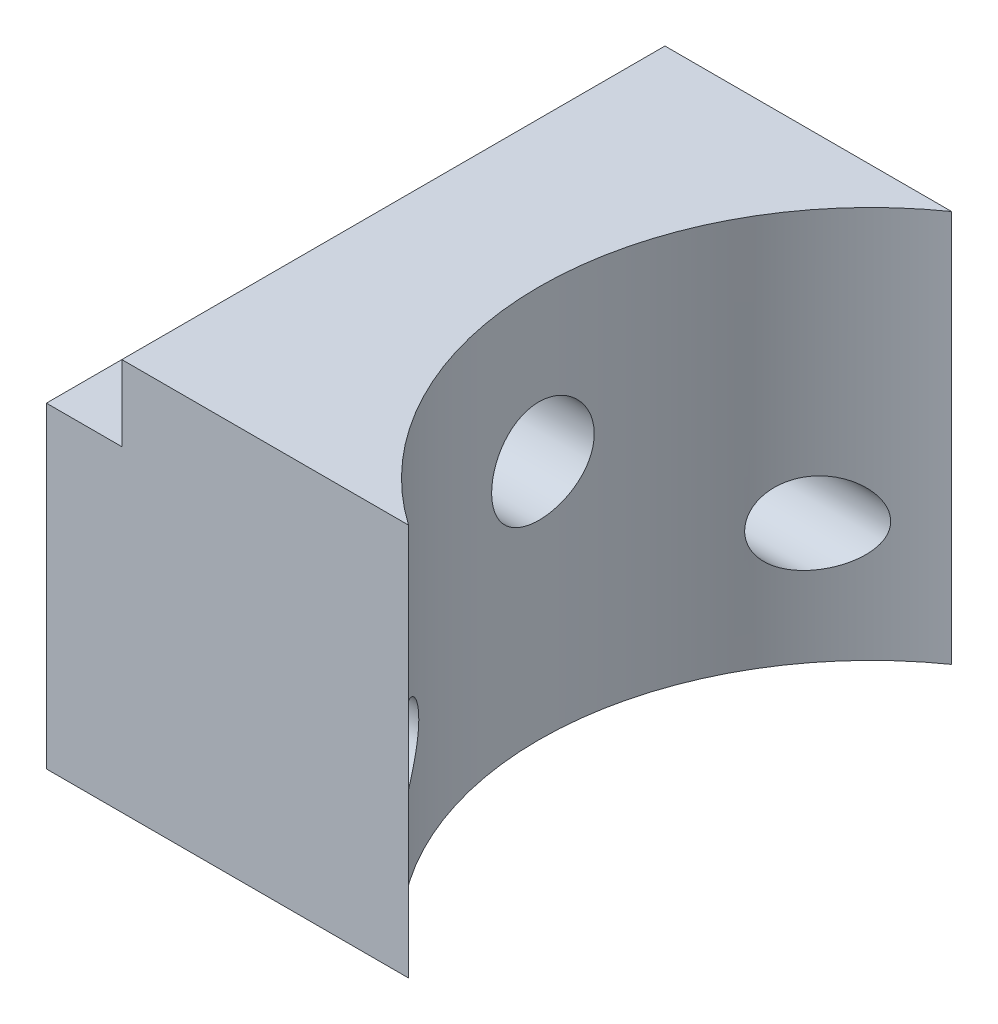
ISO-10303-21;
HEADER;
FILE_DESCRIPTION(('STEP AP214'),'2;1');
FILE_NAME('part.step','',(''),(''),'','','');
FILE_SCHEMA(('AUTOMOTIVE_DESIGN { 1 0 10303 214 1 1 1 1 }'));
ENDSEC;
DATA;
#1=APPLICATION_CONTEXT('core data for automotive mechanical design processes');
#2=APPLICATION_PROTOCOL_DEFINITION('international standard','automotive_design',2000,#1);
#3=PRODUCT_CONTEXT('',#1,'mechanical');
#4=PRODUCT('Part','Part','',(#3));
#5=PRODUCT_RELATED_PRODUCT_CATEGORY('part','',(#4));
#6=PRODUCT_DEFINITION_FORMATION('','',#4);
#7=PRODUCT_DEFINITION_CONTEXT('part definition',#1,'design');
#8=PRODUCT_DEFINITION('design','',#6,#7);
#9=PRODUCT_DEFINITION_SHAPE('','',#8);
#10=(LENGTH_UNIT() NAMED_UNIT(*) SI_UNIT(.MILLI.,.METRE.));
#11=(NAMED_UNIT(*) PLANE_ANGLE_UNIT() SI_UNIT($,.RADIAN.));
#12=(NAMED_UNIT(*) SI_UNIT($,.STERADIAN.) SOLID_ANGLE_UNIT());
#13=UNCERTAINTY_MEASURE_WITH_UNIT(LENGTH_MEASURE(1.E-05),#10,'distance_accuracy_value','');
#14=(GEOMETRIC_REPRESENTATION_CONTEXT(3) GLOBAL_UNCERTAINTY_ASSIGNED_CONTEXT((#13)) GLOBAL_UNIT_ASSIGNED_CONTEXT((#10,
#11,#12)) REPRESENTATION_CONTEXT('',''));
#15=CARTESIAN_POINT('',(0.,0.,0.));
#16=DIRECTION('',(0.,0.,1.));
#17=DIRECTION('',(1.,0.,0.));
#18=AXIS2_PLACEMENT_3D('',#15,#16,#17);
#19=CARTESIAN_POINT('',(12.,13.,-9.));
#20=DIRECTION('',(0.,0.,1.));
#21=DIRECTION('',(1.,0.,0.));
#22=AXIS2_PLACEMENT_3D('',#19,#20,#21);
#23=PLANE('',#22);
#24=DIRECTION('',(0.,-1.,0.));
#25=VECTOR('',#24,1.);
#26=CARTESIAN_POINT('',(2.5,13.,-9.));
#27=LINE('',#26,#25);
#28=CARTESIAN_POINT('',(2.5,13.,-9.));
#29=VERTEX_POINT('',#28);
#30=CARTESIAN_POINT('',(2.5,10.5,-9.));
#31=VERTEX_POINT('',#30);
#32=EDGE_CURVE('E252',#29,#31,#27,.T.);
#33=ORIENTED_EDGE('',*,*,#32,.F.);
#34=DIRECTION('',(-1.,0.,0.));
#35=VECTOR('',#34,1.);
#36=CARTESIAN_POINT('',(12.,13.,-9.));
#37=LINE('',#36,#35);
#38=CARTESIAN_POINT('',(12.,13.,-9.));
#39=VERTEX_POINT('',#38);
#40=EDGE_CURVE('E92',#39,#29,#37,.T.);
#41=ORIENTED_EDGE('',*,*,#40,.F.);
#42=DIRECTION('',(0.,-1.,0.));
#43=VECTOR('',#42,1.);
#44=CARTESIAN_POINT('',(12.,13.,-9.));
#45=LINE('',#44,#43);
#46=CARTESIAN_POINT('',(12.,0.,-9.));
#47=VERTEX_POINT('',#46);
#48=EDGE_CURVE('E83',#39,#47,#45,.T.);
#49=ORIENTED_EDGE('',*,*,#48,.T.);
#50=DIRECTION('',(-1.,0.,0.));
#51=VECTOR('',#50,1.);
#52=CARTESIAN_POINT('',(12.,0.,-9.));
#53=LINE('',#52,#51);
#54=CARTESIAN_POINT('',(0.,0.,-9.));
#55=VERTEX_POINT('',#54);
#56=EDGE_CURVE('E96',#47,#55,#53,.T.);
#57=ORIENTED_EDGE('',*,*,#56,.T.);
#58=DIRECTION('',(0.,-1.,0.));
#59=VECTOR('',#58,1.);
#60=CARTESIAN_POINT('',(0.,13.,-9.));
#61=LINE('',#60,#59);
#62=CARTESIAN_POINT('',(0.,10.5,-9.));
#63=VERTEX_POINT('',#62);
#64=EDGE_CURVE('E120',#63,#55,#61,.T.);
#65=ORIENTED_EDGE('',*,*,#64,.F.);
#66=DIRECTION('',(-1.,0.,0.));
#67=VECTOR('',#66,1.);
#68=CARTESIAN_POINT('',(2.5,10.5,-9.));
#69=LINE('',#68,#67);
#70=EDGE_CURVE('E230',#31,#63,#69,.T.);
#71=ORIENTED_EDGE('',*,*,#70,.F.);
#72=EDGE_LOOP('',(#33,#41,#49,#57,#65,#71));
#73=FACE_BOUND('',#72,.T.);
#74=ADVANCED_FACE('F39',(#73),#23,.F.);
#75=CARTESIAN_POINT('',(0.,13.,-9.));
#76=DIRECTION('',(1.,0.,0.));
#77=DIRECTION('',(0.,0.,-1.));
#78=AXIS2_PLACEMENT_3D('',#75,#76,#77);
#79=PLANE('',#78);
#80=CARTESIAN_POINT('',(0.,4.,-6.75));
#81=DIRECTION('',(-1.,0.,0.));
#82=DIRECTION('',(0.,0.,1.));
#83=AXIS2_PLACEMENT_3D('',#80,#81,#82);
#84=CIRCLE('',#83,1.35);
#85=CARTESIAN_POINT('',(0.,4.,-5.4));
#86=VERTEX_POINT('',#85);
#87=EDGE_CURVE('E194',#86,#86,#84,.T.);
#88=ORIENTED_EDGE('',*,*,#87,.F.);
#89=EDGE_LOOP('',(#88));
#90=FACE_BOUND('',#89,.T.);
#91=CARTESIAN_POINT('',(0.,4.,6.75));
#92=DIRECTION('',(-1.,0.,0.));
#93=DIRECTION('',(0.,0.,1.));
#94=AXIS2_PLACEMENT_3D('',#91,#92,#93);
#95=CIRCLE('',#94,1.35);
#96=CARTESIAN_POINT('',(0.,4.,8.1));
#97=VERTEX_POINT('',#96);
#98=EDGE_CURVE('E148',#97,#97,#95,.T.);
#99=ORIENTED_EDGE('',*,*,#98,.F.);
#100=EDGE_LOOP('',(#99));
#101=FACE_BOUND('',#100,.T.);
#102=DIRECTION('',(0.,0.,1.));
#103=VECTOR('',#102,1.);
#104=CARTESIAN_POINT('',(0.,10.5,-9.));
#105=LINE('',#104,#103);
#106=CARTESIAN_POINT('',(0.,10.5,-2.24490534321606));
#107=VERTEX_POINT('',#106);
#108=EDGE_CURVE('E136',#63,#107,#105,.T.);
#109=ORIENTED_EDGE('',*,*,#108,.F.);
#110=ORIENTED_EDGE('',*,*,#64,.T.);
#111=DIRECTION('',(0.,0.,1.));
#112=VECTOR('',#111,1.);
#113=CARTESIAN_POINT('',(0.,0.,-9.));
#114=LINE('',#113,#112);
#115=CARTESIAN_POINT('',(0.,0.,9.));
#116=VERTEX_POINT('',#115);
#117=EDGE_CURVE('E101',#55,#116,#114,.T.);
#118=ORIENTED_EDGE('',*,*,#117,.T.);
#119=DIRECTION('',(0.,-1.,0.));
#120=VECTOR('',#119,1.);
#121=CARTESIAN_POINT('',(0.,13.,9.));
#122=LINE('',#121,#120);
#123=CARTESIAN_POINT('',(0.,10.5,9.));
#124=VERTEX_POINT('',#123);
#125=EDGE_CURVE('E114',#124,#116,#122,.T.);
#126=ORIENTED_EDGE('',*,*,#125,.F.);
#127=CARTESIAN_POINT('',(0.,10.5,2.24490534321606));
#128=VERTEX_POINT('',#127);
#129=EDGE_CURVE('E145',#128,#124,#105,.T.);
#130=ORIENTED_EDGE('',*,*,#129,.F.);
#131=CARTESIAN_POINT('',(0.,8.,0.));
#132=DIRECTION('',(-1.,0.,0.));
#133=DIRECTION('',(0.,0.,1.));
#134=AXIS2_PLACEMENT_3D('',#131,#132,#133);
#135=CIRCLE('',#134,3.36);
#136=EDGE_CURVE('E128',#107,#128,#135,.T.);
#137=ORIENTED_EDGE('',*,*,#136,.F.);
#138=EDGE_LOOP('',(#109,#110,#118,#126,#130,#137));
#139=FACE_BOUND('',#138,.T.);
#140=ADVANCED_FACE('F139',(#90,#101,#139),#79,.F.);
#141=CARTESIAN_POINT('',(0.,13.,9.));
#142=DIRECTION('',(0.,0.,-1.));
#143=DIRECTION('',(-1.,0.,0.));
#144=AXIS2_PLACEMENT_3D('',#141,#142,#143);
#145=PLANE('',#144);
#146=DIRECTION('',(0.,1.,0.));
#147=VECTOR('',#146,1.);
#148=CARTESIAN_POINT('',(2.5,13.,9.));
#149=LINE('',#148,#147);
#150=CARTESIAN_POINT('',(2.5,10.5,9.));
#151=VERTEX_POINT('',#150);
#152=CARTESIAN_POINT('',(2.5,13.,9.));
#153=VERTEX_POINT('',#152);
#154=EDGE_CURVE('E229',#151,#153,#149,.T.);
#155=ORIENTED_EDGE('',*,*,#154,.F.);
#156=DIRECTION('',(-1.,0.,0.));
#157=VECTOR('',#156,1.);
#158=CARTESIAN_POINT('',(2.5,10.5,9.));
#159=LINE('',#158,#157);
#160=EDGE_CURVE('E236',#151,#124,#159,.T.);
#161=ORIENTED_EDGE('',*,*,#160,.T.);
#162=ORIENTED_EDGE('',*,*,#125,.T.);
#163=DIRECTION('',(1.,0.,0.));
#164=VECTOR('',#163,1.);
#165=CARTESIAN_POINT('',(0.,0.,9.));
#166=LINE('',#165,#164);
#167=CARTESIAN_POINT('',(12.,0.,8.99999999999999));
#168=VERTEX_POINT('',#167);
#169=EDGE_CURVE('E94',#116,#168,#166,.T.);
#170=ORIENTED_EDGE('',*,*,#169,.T.);
#171=DIRECTION('',(0.,-1.,0.));
#172=VECTOR('',#171,1.);
#173=CARTESIAN_POINT('',(12.,13.,8.99999999999999));
#174=LINE('',#173,#172);
#175=CARTESIAN_POINT('',(12.,13.,8.99999999999999));
#176=VERTEX_POINT('',#175);
#177=EDGE_CURVE('E90',#176,#168,#174,.T.);
#178=ORIENTED_EDGE('',*,*,#177,.F.);
#179=DIRECTION('',(1.,0.,0.));
#180=VECTOR('',#179,1.);
#181=CARTESIAN_POINT('',(0.,13.,9.));
#182=LINE('',#181,#180);
#183=EDGE_CURVE('E223',#153,#176,#182,.T.);
#184=ORIENTED_EDGE('',*,*,#183,.F.);
#185=EDGE_LOOP('',(#155,#161,#162,#170,#178,#184));
#186=FACE_BOUND('',#185,.T.);
#187=ADVANCED_FACE('F204',(#186),#145,.F.);
#188=CARTESIAN_POINT('',(18.3245553203368,13.,0.));
#189=DIRECTION('',(0.,-1.,0.));
#190=DIRECTION('',(0.,0.,-1.));
#191=AXIS2_PLACEMENT_3D('',#188,#189,#190);
#192=CYLINDRICAL_SURFACE('',#191,11.);
#193=CARTESIAN_POINT('',(8.74123647976801,4.,-5.4));
#194=CARTESIAN_POINT('',(8.74123780720824,4.06811575397113,-5.40000334153807));
#195=CARTESIAN_POINT('',(8.74415407312713,4.13633418293292,-5.40518790257511));
#196=CARTESIAN_POINT('',(8.75574963011958,4.27082281908254,-5.4256880380407));
#197=CARTESIAN_POINT('',(8.76444211762133,4.33708820143845,-5.44102681060417));
#198=CARTESIAN_POINT('',(8.78731714425611,4.46551535614343,-5.48102292140751));
#199=CARTESIAN_POINT('',(8.80148328056868,4.52768874554528,-5.50565241307167));
#200=CARTESIAN_POINT('',(8.83491620880317,4.64659101883266,-5.5630789813249));
#201=CARTESIAN_POINT('',(8.85418117926204,4.70332183713395,-5.5958731409915));
#202=CARTESIAN_POINT('',(8.89820715352669,4.81242621078429,-5.66973329551245));
#203=CARTESIAN_POINT('',(8.92315802732322,4.86453278384552,-5.71107891057128));
#204=CARTESIAN_POINT('',(8.97746909910318,4.96094414948597,-5.79954079128561));
#205=CARTESIAN_POINT('',(9.00683109710487,5.00524574102916,-5.84665941123842));
#206=CARTESIAN_POINT('',(9.07302289316949,5.09041673004276,-5.9509145819108));
#207=CARTESIAN_POINT('',(9.11032474725246,5.13027196923498,-6.00857776609042));
#208=CARTESIAN_POINT('',(9.18882690628527,5.19977344705766,-6.1272784122497));
#209=CARTESIAN_POINT('',(9.23002932669268,5.22941410494471,-6.1883176976983));
#210=CARTESIAN_POINT('',(9.32242030915201,5.28273168380804,-6.32211801049656));
#211=CARTESIAN_POINT('',(9.37415054863706,5.30468924360317,-6.39518868622121));
#212=CARTESIAN_POINT('',(9.48069963376513,5.33594669187346,-6.54174660635673));
#213=CARTESIAN_POINT('',(9.53551994441446,5.34524052299526,-6.61523403324582));
#214=CARTESIAN_POINT('',(9.65724959688579,5.35252540715512,-6.77418036476564));
#215=CARTESIAN_POINT('',(9.7245691953396,5.34820096243836,-6.8594329175906));
#216=CARTESIAN_POINT('',(9.86063856265683,5.32405318712753,-7.02664710845529));
#217=CARTESIAN_POINT('',(9.92939010528242,5.30420936553133,-7.1086042448603));
#218=CARTESIAN_POINT('',(10.0762168322407,5.24586170686655,-7.278681542678));
#219=CARTESIAN_POINT('',(10.1542617132514,5.20515029963291,-7.36607836827799));
#220=CARTESIAN_POINT('',(10.307186226998,5.10455426991447,-7.53222946913921));
#221=CARTESIAN_POINT('',(10.3820693873231,5.04469169089895,-7.61099354165055));
#222=CARTESIAN_POINT('',(10.5005242677507,4.92843927918614,-7.73234575389116));
#223=CARTESIAN_POINT('',(10.5461882149354,4.87759121227092,-7.77821938948881));
#224=CARTESIAN_POINT('',(10.6322560042187,4.76670489080042,-7.86334321080989));
#225=CARTESIAN_POINT('',(10.6726689229628,4.70668289556569,-7.90260486141094));
#226=CARTESIAN_POINT('',(10.7368436771693,4.59279635990178,-7.96417764189583));
#227=CARTESIAN_POINT('',(10.7622796569069,4.54086331500674,-7.98829928431901));
#228=CARTESIAN_POINT('',(10.8069271598248,4.43202103897927,-8.03033051533878));
#229=CARTESIAN_POINT('',(10.8261469419809,4.37511853917449,-8.04824834870363));
#230=CARTESIAN_POINT('',(10.8543994844174,4.26630477072259,-8.07447145252898));
#231=CARTESIAN_POINT('',(10.8645309304155,4.21493358558606,-8.08381840595869));
#232=CARTESIAN_POINT('',(10.8782802160668,4.11059801379519,-8.09648552927805));
#233=CARTESIAN_POINT('',(10.8819021026708,4.05763463783583,-8.09980944366253));
#234=CARTESIAN_POINT('',(10.8822997008726,3.95159501949748,-8.10017478196716));
#235=CARTESIAN_POINT('',(10.8790669110544,3.89851871861844,-8.09720840444083));
#236=CARTESIAN_POINT('',(10.8660425647437,3.79388154831534,-8.08521259313974));
#237=CARTESIAN_POINT('',(10.8562479302975,3.74232140192491,-8.07618031403757));
#238=CARTESIAN_POINT('',(10.8309633815783,3.64216270389128,-8.05272443860359));
#239=CARTESIAN_POINT('',(10.8154956778009,3.59355345284501,-8.03832186377579));
#240=CARTESIAN_POINT('',(10.7798767820826,3.4997918654232,-8.00489996930309));
#241=CARTESIAN_POINT('',(10.7597234177434,3.45464114546402,-7.98587850803593));
#242=CARTESIAN_POINT('',(10.7033468015869,3.34380054936908,-7.93217579135498));
#243=CARTESIAN_POINT('',(10.6644550570669,3.28081660940338,-7.89469934317089));
#244=CARTESIAN_POINT('',(10.5806837963313,3.16417391413258,-7.81254908892083));
#245=CARTESIAN_POINT('',(10.5357880786842,3.11054132827988,-7.76785573820595));
#246=CARTESIAN_POINT('',(10.4250102386749,2.99429632009436,-7.6554199337985));
#247=CARTESIAN_POINT('',(10.357475261271,2.93561759157857,-7.5852399526719));
#248=CARTESIAN_POINT('',(10.2190266777701,2.83448888139043,-7.43711836989357));
#249=CARTESIAN_POINT('',(10.1481112920251,2.79204755657928,-7.35917265582683));
#250=CARTESIAN_POINT('',(10.0039619863153,2.72259603980555,-7.19581830573967));
#251=CARTESIAN_POINT('',(9.93070947242034,2.6958873855699,-7.11029786956805));
#252=CARTESIAN_POINT('',(9.78515950879359,2.65971346547805,-6.93481967753396));
#253=CARTESIAN_POINT('',(9.71286254914707,2.6502567312193,-6.84485974878019));
#254=CARTESIAN_POINT('',(9.56499466882048,2.64973192175162,-6.65475685367272));
#255=CARTESIAN_POINT('',(9.48967497050634,2.66031100025196,-6.55440238009465));
#256=CARTESIAN_POINT('',(9.3449791284309,2.70513970597262,-6.35470829643263));
#257=CARTESIAN_POINT('',(9.27559113301233,2.73934083185779,-6.25536702934289));
#258=CARTESIAN_POINT('',(9.1658736365018,2.81834239376354,-6.09302875404079));
#259=CARTESIAN_POINT('',(9.12322614565071,2.85652060121134,-6.02835136234432));
#260=CARTESIAN_POINT('',(9.04310918869679,2.94501015677236,-5.90425174864896));
#261=CARTESIAN_POINT('',(9.00563640867608,2.99531368254413,-5.84482617221639));
#262=CARTESIAN_POINT('',(8.93671677362141,3.10808362414673,-5.7334822452645));
#263=CARTESIAN_POINT('',(8.90531575157084,3.17063588198141,-5.6816216691025));
#264=CARTESIAN_POINT('',(8.8499987629577,3.30641019458472,-5.58889153871178));
#265=CARTESIAN_POINT('',(8.82608119664677,3.37962996403331,-5.54801963568295));
#266=CARTESIAN_POINT('',(8.78927201993712,3.5242084208724,-5.48448243547574));
#267=CARTESIAN_POINT('',(8.77535174178239,3.59457341825809,-5.46014180252806));
#268=CARTESIAN_POINT('',(8.75440501786413,3.73919525046723,-5.42334601618081));
#269=CARTESIAN_POINT('',(8.74735690984613,3.81343907377672,-5.41085351885491));
#270=CARTESIAN_POINT('',(8.74297844613081,3.90680624337288,-5.40309024681569));
#271=CARTESIAN_POINT('',(8.74232571735557,3.92541791681954,-5.40193266076909));
#272=CARTESIAN_POINT('',(8.74145455268834,3.96268382457033,-5.40038708024524));
#273=CARTESIAN_POINT('',(8.74123611608399,3.9813380588046,-5.39999908450567));
#274=CARTESIAN_POINT('',(8.74123647976801,4.,-5.4));
#275=B_SPLINE_CURVE_WITH_KNOTS('',3,(#193,#194,#195,#196,#197,#198,#199,#200,#201,#202,#203,
#204,#205,#206,#207,#208,#209,#210,#211,#212,#213,#214,#215,#216,#217,#218,#219,#220,#221,#222,
#223,#224,#225,#226,#227,#228,#229,#230,#231,#232,#233,#234,#235,#236,#237,#238,#239,#240,#241,
#242,#243,#244,#245,#246,#247,#248,#249,#250,#251,#252,#253,#254,#255,#256,#257,#258,#259,#260,
#261,#262,#263,#264,#265,#266,#267,#268,#269,#270,#271,#272,#273,#274),.UNSPECIFIED.,.T.,.F.,(4,
2,2,2,2,2,2,2,2,2,2,2,2,2,2,2,2,2,2,2,2,2,2,2,2,2,2,2,2,2,2,2,2,2,2,2,2,2,2,2,4),(0.,
0.204271083293457,0.409010458742281,0.613140993794563,0.817198705230121,1.0294627635296,
1.24181367547861,1.47910410745981,1.71652397845208,1.99202873099034,2.26766521759765,
2.5925373049234,2.91783906262398,3.28828924072435,3.65831454648231,3.90451216940545,
4.15027840065483,4.33758425625309,4.52464022103117,4.68350718431636,4.84227534683296,
5.0012405344994,5.16028033996344,5.31870402563654,5.47720130777734,5.72471294754059,
5.97290649515212,6.31223259151253,6.6517393460013,6.99755764583697,7.34354691699467,
7.71921843142194,8.09412089250211,8.35221854603754,8.61015013796724,8.86995861826819,
9.12971152095653,9.35572352901097,9.58102078299401,9.63698582742154,9.69295078005143),.UNSPECIFIED.);
#276=CARTESIAN_POINT('',(8.74123647976801,4.,-5.4));
#277=VERTEX_POINT('',#276);
#278=EDGE_CURVE('E186',#277,#277,#275,.T.);
#279=ORIENTED_EDGE('',*,*,#278,.T.);
#280=EDGE_LOOP('',(#279));
#281=FACE_BOUND('',#280,.T.);
#282=CARTESIAN_POINT('',(10.8821094858009,4.,8.09999999999999));
#283=CARTESIAN_POINT('',(10.882103598959,4.05951235537736,8.09999525975712));
#284=CARTESIAN_POINT('',(10.8777712146607,4.11913603994396,8.09602044233788));
#285=CARTESIAN_POINT('',(10.860919433459,4.23626643357067,8.0804864609018));
#286=CARTESIAN_POINT('',(10.8483760566117,4.2937664192074,8.06890508183069));
#287=CARTESIAN_POINT('',(10.8165098405061,4.40442468828557,8.03926082917154));
#288=CARTESIAN_POINT('',(10.7972506294667,4.45761814011082,8.02125875227088));
#289=CARTESIAN_POINT('',(10.7533819178382,4.55942674565197,7.97986493596433));
#290=CARTESIAN_POINT('',(10.728771803437,4.60804137320461,7.95647257821074));
#291=CARTESIAN_POINT('',(10.6624658663824,4.72306965039336,7.89274258873086));
#292=CARTESIAN_POINT('',(10.6182992667029,4.78656505909214,7.84971176059619));
#293=CARTESIAN_POINT('',(10.5242557821147,4.90305970943097,7.75627215063191));
#294=CARTESIAN_POINT('',(10.4743647577707,4.95603203838997,7.70584501048367));
#295=CARTESIAN_POINT('',(10.3537460257551,5.06800432576466,7.5812922349082));
#296=CARTESIAN_POINT('',(10.2816591951345,5.12302708955422,7.50490456503966));
#297=CARTESIAN_POINT('',(10.1349059139225,5.2155919807968,7.34448820439893));
#298=CARTESIAN_POINT('',(10.0602377815897,5.25312247220799,7.26045447167495));
#299=CARTESIAN_POINT('',(9.90977396949243,5.31091505494083,7.0855436560415));
#300=CARTESIAN_POINT('',(9.83397626708852,5.33094594378026,6.99459171668292));
#301=CARTESIAN_POINT('',(9.68438343413547,5.35193889506266,6.80893581411877));
#302=CARTESIAN_POINT('',(9.61058687384292,5.35291495020032,6.71423465532162));
#303=CARTESIAN_POINT('',(9.47706074759323,5.33563382220148,6.53700243676968));
#304=CARTESIAN_POINT('',(9.41680300701323,5.32003505640546,6.45461233683403));
#305=CARTESIAN_POINT('',(9.30077304023224,5.27254232758069,6.29137005807338));
#306=CARTESIAN_POINT('',(9.24499583222327,5.24066676094709,6.21051624967241));
#307=CARTESIAN_POINT('',(9.14841307829623,5.16660875220303,6.0666819794889));
#308=CARTESIAN_POINT('',(9.10666673946374,5.12705858203505,6.00298128263864));
#309=CARTESIAN_POINT('',(9.02841723321328,5.03597840513526,5.88107595974069));
#310=CARTESIAN_POINT('',(8.99191293655836,4.98445098481598,5.82287015091651));
#311=CARTESIAN_POINT('',(8.92499614477583,4.86946787805522,5.71422762549259));
#312=CARTESIAN_POINT('',(8.89463006776536,4.80592785669335,5.66385072850396));
#313=CARTESIAN_POINT('',(8.84143280510697,4.66857447612418,5.57432635602495));
#314=CARTESIAN_POINT('',(8.81859550133795,4.59476952822474,5.5351697659573));
#315=CARTESIAN_POINT('',(8.78383410092053,4.44968981887476,5.47500569213819));
#316=CARTESIAN_POINT('',(8.77086499534047,4.37937535811481,5.45228098037988));
#317=CARTESIAN_POINT('',(8.75170556744063,4.23510884743609,5.41857292700568));
#318=CARTESIAN_POINT('',(8.74551067116206,4.16115928723964,5.40758166306319));
#319=CARTESIAN_POINT('',(8.74035722917086,4.01921323210086,5.3984411472576));
#320=CARTESIAN_POINT('',(8.74077544094956,3.95130765050891,5.3991858339714));
#321=CARTESIAN_POINT('',(8.74732932597459,3.81666052569548,5.41080278424763));
#322=CARTESIAN_POINT('',(8.75346377032285,3.74991873541922,5.42167287101172));
#323=CARTESIAN_POINT('',(8.77110678669101,3.62073303678791,5.45269915285419));
#324=CARTESIAN_POINT('',(8.78251287063502,3.55823214630917,5.47267816165437));
#325=CARTESIAN_POINT('',(8.8103586628929,3.43773829972475,5.5209450399949));
#326=CARTESIAN_POINT('',(8.82679899262252,3.37974590124569,5.54923393527101));
#327=CARTESIAN_POINT('',(8.86518985596874,3.26689801348456,5.6144364198741));
#328=CARTESIAN_POINT('',(8.88736228564837,3.21231640660296,5.65169172572921));
#329=CARTESIAN_POINT('',(8.93623908025945,3.11035659949846,5.732516659052));
#330=CARTESIAN_POINT('',(8.9629449524054,3.06298080492596,5.77608838580771));
#331=CARTESIAN_POINT('',(9.02328938215819,2.97143925048765,5.87282048119688));
#332=CARTESIAN_POINT('',(9.05735968543141,2.92811595606951,5.92650664023722));
#333=CARTESIAN_POINT('',(9.12953951181062,2.85109197624492,6.0378883977719));
#334=CARTESIAN_POINT('',(9.16765104756037,2.81739611671797,6.0955859890967));
#335=CARTESIAN_POINT('',(9.25319312573402,2.75511260772003,6.22230397035571));
#336=CARTESIAN_POINT('',(9.30116149298393,2.72806713089825,6.29171752739778));
#337=CARTESIAN_POINT('',(9.40043774970106,2.68600749002035,6.43175820210199));
#338=CARTESIAN_POINT('',(9.45174736789529,2.67099960842556,6.5023859338316));
#339=CARTESIAN_POINT('',(9.56613507133321,2.65068386863004,6.65588257860435));
#340=CARTESIAN_POINT('',(9.62968266085403,2.64757717220285,6.73869346926702));
#341=CARTESIAN_POINT('',(9.75875817316983,2.65609244538329,6.90202784169792));
#342=CARTESIAN_POINT('',(9.82428799690633,2.66772902082564,6.98254897420624));
#343=CARTESIAN_POINT('',(9.96628385804821,2.707902422709,7.15215737296065));
#344=CARTESIAN_POINT('',(10.0428517298857,2.73880563010678,7.24060491897457));
#345=CARTESIAN_POINT('',(10.1944303133752,2.81881998663506,7.41039784857872));
#346=CARTESIAN_POINT('',(10.2694412285806,2.86792873957417,7.49174416508396));
#347=CARTESIAN_POINT('',(10.3977302241766,2.97105769174506,7.62705885839956));
#348=CARTESIAN_POINT('',(10.452001915217,3.02127193464795,7.68299177881053));
#349=CARTESIAN_POINT('',(10.5555500257653,3.13306873590745,7.78767858778913));
#350=CARTESIAN_POINT('',(10.6048354258604,3.19463027152729,7.83644545719228));
#351=CARTESIAN_POINT('',(10.68272628591,3.31083879353462,7.91230382051736));
#352=CARTESIAN_POINT('',(10.7132820529303,3.3626923042669,7.94166044694198));
#353=CARTESIAN_POINT('',(10.7684166654864,3.47244950722632,7.9941362258023));
#354=CARTESIAN_POINT('',(10.7930017781193,3.53034676353351,8.0172619213503));
#355=CARTESIAN_POINT('',(10.83044579945,3.64037756554388,8.05225808381174));
#356=CARTESIAN_POINT('',(10.8446227279262,3.69165211792813,8.06540915667152));
#357=CARTESIAN_POINT('',(10.8665182906716,3.79665684309461,8.0856608863714));
#358=CARTESIAN_POINT('',(10.8742547410684,3.85037980516689,8.09277823515414));
#359=CARTESIAN_POINT('',(10.8796562596869,3.92039090698682,8.09774530118276));
#360=CARTESIAN_POINT('',(10.8805745519391,3.93628384614881,8.0985894634502));
#361=CARTESIAN_POINT('',(10.8818020075389,3.96811518745023,8.0997174974678));
#362=CARTESIAN_POINT('',(10.8821110631869,3.98405359712924,8.10000127015343));
#363=CARTESIAN_POINT('',(10.8821094858009,4.,8.09999999999999));
#364=B_SPLINE_CURVE_WITH_KNOTS('',3,(#282,#283,#284,#285,#286,#287,#288,#289,#290,#291,#292,
#293,#294,#295,#296,#297,#298,#299,#300,#301,#302,#303,#304,#305,#306,#307,#308,#309,#310,#311,
#312,#313,#314,#315,#316,#317,#318,#319,#320,#321,#322,#323,#324,#325,#326,#327,#328,#329,#330,
#331,#332,#333,#334,#335,#336,#337,#338,#339,#340,#341,#342,#343,#344,#345,#346,#347,#348,#349,
#350,#351,#352,#353,#354,#355,#356,#357,#358,#359,#360,#361,#362,#363),.UNSPECIFIED.,.T.,.F.,(4,
2,2,2,2,2,2,2,2,2,2,2,2,2,2,2,2,2,2,2,2,2,2,2,2,2,2,2,2,2,2,2,2,2,2,2,2,2,2,2,4),(0.,
0.17845888820757,0.357441299217909,0.534772081063738,0.712123215600549,0.976182265136714,
1.24090818671843,1.59477973153616,1.94888634059893,2.30760352890081,2.66605728750633,
2.97461308737358,3.28282092009508,3.53923428083164,3.79559232205701,4.05382187960805,
4.31184107133209,4.53567556474428,4.75935883119013,4.96209822699545,5.16479404714446,
5.363704999649,5.56264051516943,5.77088755476757,5.97920396546713,6.20912470937448,
6.43916050271507,6.70396981919661,6.96891725078437,7.28100855472534,7.59340928254259,
7.95485389407848,8.31625094960174,8.59350070008218,8.870241870177,9.07047603682506,
9.2704991103775,9.43424632505833,9.59753905055257,9.64534886033831,9.69316712108738),.UNSPECIFIED.);
#365=CARTESIAN_POINT('',(10.8821094858009,4.,8.09999999999999));
#366=VERTEX_POINT('',#365);
#367=EDGE_CURVE('E144',#366,#366,#364,.T.);
#368=ORIENTED_EDGE('',*,*,#367,.T.);
#369=EDGE_LOOP('',(#368));
#370=FACE_BOUND('',#369,.T.);
#371=CARTESIAN_POINT('',(7.45671284816226,8.,1.7));
#372=CARTESIAN_POINT('',(7.45671122565653,8.09487595826831,1.69999610755591));
#373=CARTESIAN_POINT('',(7.45545700263866,8.18980613541623,1.6920306779109));
#374=CARTESIAN_POINT('',(7.45057933056116,8.37700987054634,1.66038928989785));
#375=CARTESIAN_POINT('',(7.44695360373136,8.46928078532571,1.63669822712725));
#376=CARTESIAN_POINT('',(7.4377531666663,8.64842929703237,1.57433341105388));
#377=CARTESIAN_POINT('',(7.43217998739698,8.73531106757795,1.53567142438552));
#378=CARTESIAN_POINT('',(7.4197144170862,8.90134272692081,1.4444903760089));
#379=CARTESIAN_POINT('',(7.41282219894975,8.98049362706066,1.39197313016367));
#380=CARTESIAN_POINT('',(7.39842970599249,9.12950035855093,1.27409624029085));
#381=CARTESIAN_POINT('',(7.39092521026717,9.19928102217056,1.20864208083874));
#382=CARTESIAN_POINT('',(7.37619135501432,9.32691467706427,1.06695350916278));
#383=CARTESIAN_POINT('',(7.36896201093659,9.38476699936408,0.990718492722729));
#384=CARTESIAN_POINT('',(7.35554870932058,9.48718039408429,0.829149193708837));
#385=CARTESIAN_POINT('',(7.34937028171703,9.53167204704634,0.743770410219584));
#386=CARTESIAN_POINT('',(7.33880176391523,9.60565547368259,0.566640223065991));
#387=CARTESIAN_POINT('',(7.3344115735302,9.63514808770754,0.474889176747679));
#388=CARTESIAN_POINT('',(7.32794396856131,9.6780678319731,0.288393768619387));
#389=CARTESIAN_POINT('',(7.32584842522988,9.69162095544619,0.193679041576664));
#390=CARTESIAN_POINT('',(7.32414405192842,9.70266836222251,0.00329818574173119));
#391=CARTESIAN_POINT('',(7.32453507562637,9.70016359051702,-0.0923678867339268));
#392=CARTESIAN_POINT('',(7.32774532893965,9.67926542940278,-0.2810757382545));
#393=CARTESIAN_POINT('',(7.33054384068373,9.66100760050928,-0.374132932319581));
#394=CARTESIAN_POINT('',(7.33823154650693,9.60933456112834,-0.555846715768802));
#395=CARTESIAN_POINT('',(7.34312079705944,9.57591894120895,-0.644503186211814));
#396=CARTESIAN_POINT('',(7.35447614920475,9.49474115742986,-0.815307316794447));
#397=CARTESIAN_POINT('',(7.36094846885789,9.44692224381777,-0.897427575360491));
#398=CARTESIAN_POINT('',(7.37474920978581,9.3383367459924,-1.0525294395163));
#399=CARTESIAN_POINT('',(7.38207769080711,9.27756925792931,-1.12551040659086));
#400=CARTESIAN_POINT('',(7.39686434649277,9.14405726097101,-1.26106160442688));
#401=CARTESIAN_POINT('',(7.40432307645843,9.07119436152517,-1.32351522193136));
#402=CARTESIAN_POINT('',(7.41845513618313,8.91596120662667,-1.4353274245354));
#403=CARTESIAN_POINT('',(7.4251284605237,8.8335908855905,-1.48468591929525));
#404=CARTESIAN_POINT('',(7.43693410024097,8.66155593808601,-1.56892439980106));
#405=CARTESIAN_POINT('',(7.44206508147934,8.57188508130728,-1.6037918606104));
#406=CARTESIAN_POINT('',(7.45018190373372,8.38786285718446,-1.65793833896147));
#407=CARTESIAN_POINT('',(7.45316790573312,8.2935118416605,-1.6772185263614));
#408=CARTESIAN_POINT('',(7.45662598457536,8.10384664099746,-1.6994821120444));
#409=CARTESIAN_POINT('',(7.45712359774205,8.00855233844021,-1.70263106041358));
#410=CARTESIAN_POINT('',(7.45561641245717,7.81879725369792,-1.69298255669579));
#411=CARTESIAN_POINT('',(7.4536116966087,7.72433644410255,-1.6801856309898));
#412=CARTESIAN_POINT('',(7.44734922791972,7.53944602946941,-1.63914924210483));
#413=CARTESIAN_POINT('',(7.44310358086678,7.44899756828416,-1.61099272620192));
#414=CARTESIAN_POINT('',(7.43284765647693,7.27410369165003,-1.5401228869966));
#415=CARTESIAN_POINT('',(7.42683728709048,7.18965858962736,-1.49740880433945));
#416=CARTESIAN_POINT('',(7.41366919022498,7.02842780077713,-1.39824042418053));
#417=CARTESIAN_POINT('',(7.40650269310722,6.95170858328964,-1.34167924373174));
#418=CARTESIAN_POINT('',(7.39185603425172,6.80879165702244,-1.21657031924684));
#419=CARTESIAN_POINT('',(7.38437585366964,6.74259458150146,-1.14802185429571));
#420=CARTESIAN_POINT('',(7.36986459116389,6.62200386578995,-1.00015396438106));
#421=CARTESIAN_POINT('',(7.3628380808691,6.56772012147118,-0.920744400647538));
#422=CARTESIAN_POINT('',(7.35009749099638,6.47326371669188,-0.75383714530304));
#423=CARTESIAN_POINT('',(7.34438337373732,6.43309065107137,-0.666339686010978));
#424=CARTESIAN_POINT('',(7.33493138418298,6.36817036370908,-0.486079095565558));
#425=CARTESIAN_POINT('',(7.33118590968924,6.3433637349496,-0.39333777519632));
#426=CARTESIAN_POINT('',(7.32606124650468,6.30968847358514,-0.204943497622448));
#427=CARTESIAN_POINT('',(7.32468189148543,6.30081872068151,-0.109290745560571));
#428=CARTESIAN_POINT('',(7.32444672951685,6.29929762149784,0.0811466697223775));
#429=CARTESIAN_POINT('',(7.32556479776767,6.30647837618009,0.175930002175677));
#430=CARTESIAN_POINT('',(7.33014600588247,6.33649371347611,0.362923975424201));
#431=CARTESIAN_POINT('',(7.33360913685649,6.35932823674767,0.455134625970881));
#432=CARTESIAN_POINT('',(7.34249306536461,6.41994205598026,0.634314848431227));
#433=CARTESIAN_POINT('',(7.34791224775918,6.45770902445577,0.721288675531852));
#434=CARTESIAN_POINT('',(7.36011401798993,6.54709756882822,0.887691267304013));
#435=CARTESIAN_POINT('',(7.36689665552963,6.59871964982354,0.967119756761719));
#436=CARTESIAN_POINT('',(7.38115618919468,6.71495707718766,1.11702710702583));
#437=CARTESIAN_POINT('',(7.38863930018898,6.77969613584693,1.18740946001764));
#438=CARTESIAN_POINT('',(7.40341120335679,6.92006956470615,1.31637211347168));
#439=CARTESIAN_POINT('',(7.41069994955417,6.99570648612511,1.3749496426691));
#440=CARTESIAN_POINT('',(7.42430478950269,7.15626309191209,1.47895713843794));
#441=CARTESIAN_POINT('',(7.43061479340755,7.24123568305891,1.52430622141775));
#442=CARTESIAN_POINT('',(7.44147617965096,7.41765075462829,1.60002001674203));
#443=CARTESIAN_POINT('',(7.44602936816264,7.50908647525622,1.63040012756376));
#444=CARTESIAN_POINT('',(7.45182065498361,7.66743244894987,1.66849643104525));
#445=CARTESIAN_POINT('',(7.45364537728229,7.733369519803,1.68029196552394));
#446=CARTESIAN_POINT('',(7.45609203748972,7.866195412511,1.69604506690806));
#447=CARTESIAN_POINT('',(7.45671399251154,7.93308422081083,1.7000027453312));
#448=CARTESIAN_POINT('',(7.45671284816226,8.,1.7));
#449=B_SPLINE_CURVE_WITH_KNOTS('',3,(#371,#372,#373,#374,#375,#376,#377,#378,#379,#380,#381,
#382,#383,#384,#385,#386,#387,#388,#389,#390,#391,#392,#393,#394,#395,#396,#397,#398,#399,#400,
#401,#402,#403,#404,#405,#406,#407,#408,#409,#410,#411,#412,#413,#414,#415,#416,#417,#418,#419,
#420,#421,#422,#423,#424,#425,#426,#427,#428,#429,#430,#431,#432,#433,#434,#435,#436,#437,#438,
#439,#440,#441,#442,#443,#444,#445,#446,#447,#448),.UNSPECIFIED.,.T.,.F.,(4,2,2,2,2,2,2,2,2,2,2,
2,2,2,2,2,2,2,2,2,2,2,2,2,2,2,2,2,2,2,2,2,2,2,2,2,2,2,4),(0.,0.2843832607852,0.569040066477245,
0.853473594284035,1.13786986288349,1.42442628209196,1.71099876780605,1.99903544334919,
2.28705597929093,2.57278422854621,2.85849566313032,3.14177269873757,3.42505738648749,
3.70947316526372,3.99390880363209,4.28131325202547,4.56871968309277,4.85637401216311,
5.14400675015651,5.4286815998444,5.71334705252767,5.99649021341382,6.279648145932,
6.56506472646204,6.85049847784597,7.13846383348924,7.426420920106,7.71325769383991,
8.00007430330667,8.28390467562728,8.56773397197527,8.85132944055717,9.13493524922648,
9.42135203539797,9.70783598178419,9.99603654463128,10.2839400153652,10.4845176811254,
10.6850924930285),.UNSPECIFIED.);
#450=CARTESIAN_POINT('',(7.45671284816226,8.,1.7));
#451=VERTEX_POINT('',#450);
#452=EDGE_CURVE('E104',#451,#451,#449,.T.);
#453=ORIENTED_EDGE('',*,*,#452,.T.);
#454=EDGE_LOOP('',(#453));
#455=FACE_BOUND('',#454,.T.);
#456=CARTESIAN_POINT('',(18.3245553203368,0.,0.));
#457=DIRECTION('',(0.,-1.,0.));
#458=DIRECTION('',(0.,0.,1.));
#459=AXIS2_PLACEMENT_3D('',#456,#457,#458);
#460=CIRCLE('',#459,11.);
#461=EDGE_CURVE('E81',#168,#47,#460,.T.);
#462=ORIENTED_EDGE('',*,*,#461,.T.);
#463=ORIENTED_EDGE('',*,*,#48,.F.);
#464=CARTESIAN_POINT('',(18.3245553203368,13.,0.));
#465=DIRECTION('',(0.,-1.,0.));
#466=DIRECTION('',(0.,0.,1.));
#467=AXIS2_PLACEMENT_3D('',#464,#465,#466);
#468=CIRCLE('',#467,11.);
#469=EDGE_CURVE('E65',#176,#39,#468,.T.);
#470=ORIENTED_EDGE('',*,*,#469,.F.);
#471=ORIENTED_EDGE('',*,*,#177,.T.);
#472=EDGE_LOOP('',(#462,#463,#470,#471));
#473=FACE_BOUND('',#472,.T.);
#474=ADVANCED_FACE('F82',(#281,#370,#455,#473),#192,.F.);
#475=CARTESIAN_POINT('',(18.3245553203368,13.,0.));
#476=DIRECTION('',(0.,1.,0.));
#477=DIRECTION('',(0.,0.,1.));
#478=AXIS2_PLACEMENT_3D('',#475,#476,#477);
#479=PLANE('',#478);
#480=DIRECTION('',(0.,0.,-1.));
#481=VECTOR('',#480,1.);
#482=CARTESIAN_POINT('',(2.5,13.,-9.));
#483=LINE('',#482,#481);
#484=EDGE_CURVE('E225',#153,#29,#483,.T.);
#485=ORIENTED_EDGE('',*,*,#484,.F.);
#486=ORIENTED_EDGE('',*,*,#183,.T.);
#487=ORIENTED_EDGE('',*,*,#469,.T.);
#488=ORIENTED_EDGE('',*,*,#40,.T.);
#489=EDGE_LOOP('',(#485,#486,#487,#488));
#490=FACE_BOUND('',#489,.T.);
#491=ADVANCED_FACE('F213',(#490),#479,.T.);
#492=CARTESIAN_POINT('',(18.3245553203368,0.,0.));
#493=DIRECTION('',(0.,1.,0.));
#494=DIRECTION('',(0.,0.,1.));
#495=AXIS2_PLACEMENT_3D('',#492,#493,#494);
#496=PLANE('',#495);
#497=ORIENTED_EDGE('',*,*,#56,.F.);
#498=ORIENTED_EDGE('',*,*,#461,.F.);
#499=ORIENTED_EDGE('',*,*,#169,.F.);
#500=ORIENTED_EDGE('',*,*,#117,.F.);
#501=EDGE_LOOP('',(#497,#498,#499,#500));
#502=FACE_BOUND('',#501,.T.);
#503=ADVANCED_FACE('F103',(#502),#496,.F.);
#504=CARTESIAN_POINT('',(0.,8.,0.));
#505=DIRECTION('',(-1.,0.,0.));
#506=DIRECTION('',(0.,0.,1.));
#507=AXIS2_PLACEMENT_3D('',#504,#505,#506);
#508=CYLINDRICAL_SURFACE('',#507,1.7);
#509=ORIENTED_EDGE('',*,*,#452,.F.);
#510=EDGE_LOOP('',(#509));
#511=FACE_BOUND('',#510,.T.);
#512=CARTESIAN_POINT('',(4.66,8.,0.));
#513=DIRECTION('',(-1.,0.,0.));
#514=DIRECTION('',(0.,0.,1.));
#515=AXIS2_PLACEMENT_3D('',#512,#513,#514);
#516=CIRCLE('',#515,1.7);
#517=CARTESIAN_POINT('',(4.66,8.,1.7));
#518=VERTEX_POINT('',#517);
#519=EDGE_CURVE('E108',#518,#518,#516,.T.);
#520=ORIENTED_EDGE('',*,*,#519,.T.);
#521=EDGE_LOOP('',(#520));
#522=FACE_BOUND('',#521,.T.);
#523=ADVANCED_FACE('F170',(#511,#522),#508,.F.);
#524=CARTESIAN_POINT('',(3.,8.,0.));
#525=DIRECTION('',(-1.,0.,0.));
#526=DIRECTION('',(0.,0.,1.));
#527=AXIS2_PLACEMENT_3D('',#524,#525,#526);
#528=CONICAL_SURFACE('',#527,3.36,0.785398163397449);
#529=ORIENTED_EDGE('',*,*,#519,.F.);
#530=EDGE_LOOP('',(#529));
#531=FACE_BOUND('',#530,.T.);
#532=CARTESIAN_POINT('',(3.,8.,0.));
#533=DIRECTION('',(-1.,0.,0.));
#534=DIRECTION('',(0.,0.,1.));
#535=AXIS2_PLACEMENT_3D('',#532,#533,#534);
#536=CIRCLE('',#535,3.36);
#537=CARTESIAN_POINT('',(3.,8.,3.36));
#538=VERTEX_POINT('',#537);
#539=EDGE_CURVE('E141',#538,#538,#536,.T.);
#540=ORIENTED_EDGE('',*,*,#539,.T.);
#541=EDGE_LOOP('',(#540));
#542=FACE_BOUND('',#541,.T.);
#543=ADVANCED_FACE('F171',(#531,#542),#528,.F.);
#544=CARTESIAN_POINT('',(0.,8.,0.));
#545=DIRECTION('',(-1.,0.,0.));
#546=DIRECTION('',(0.,0.,1.));
#547=AXIS2_PLACEMENT_3D('',#544,#545,#546);
#548=CYLINDRICAL_SURFACE('',#547,3.36);
#549=ORIENTED_EDGE('',*,*,#136,.T.);
#550=DIRECTION('',(-1.,0.,0.));
#551=VECTOR('',#550,1.);
#552=CARTESIAN_POINT('',(0.,10.5,2.24490534321606));
#553=LINE('',#552,#551);
#554=CARTESIAN_POINT('',(2.5,10.5,2.24490534321606));
#555=VERTEX_POINT('',#554);
#556=EDGE_CURVE('E11',#128,#555,#553,.F.);
#557=ORIENTED_EDGE('',*,*,#556,.T.);
#558=CARTESIAN_POINT('',(2.5,8.,0.));
#559=DIRECTION('',(-1.,0.,0.));
#560=DIRECTION('',(0.,0.,1.));
#561=AXIS2_PLACEMENT_3D('',#558,#559,#560);
#562=CIRCLE('',#561,3.36);
#563=CARTESIAN_POINT('',(2.5,10.5,-2.24490534321606));
#564=VERTEX_POINT('',#563);
#565=EDGE_CURVE('E118',#564,#555,#562,.F.);
#566=ORIENTED_EDGE('',*,*,#565,.F.);
#567=DIRECTION('',(-1.,0.,0.));
#568=VECTOR('',#567,1.);
#569=CARTESIAN_POINT('',(0.,10.5,-2.24490534321606));
#570=LINE('',#569,#568);
#571=EDGE_CURVE('E46',#564,#107,#570,.T.);
#572=ORIENTED_EDGE('',*,*,#571,.T.);
#573=EDGE_LOOP('',(#549,#557,#566,#572));
#574=FACE_BOUND('',#573,.T.);
#575=ORIENTED_EDGE('',*,*,#539,.F.);
#576=EDGE_LOOP('',(#575));
#577=FACE_BOUND('',#576,.T.);
#578=ADVANCED_FACE('F126',(#574,#577),#548,.F.);
#579=CARTESIAN_POINT('',(0.,4.,6.75));
#580=DIRECTION('',(-1.,0.,0.));
#581=DIRECTION('',(0.,0.,1.));
#582=AXIS2_PLACEMENT_3D('',#579,#580,#581);
#583=CYLINDRICAL_SURFACE('',#582,1.35);
#584=ORIENTED_EDGE('',*,*,#367,.F.);
#585=EDGE_LOOP('',(#584));
#586=FACE_BOUND('',#585,.T.);
#587=ORIENTED_EDGE('',*,*,#98,.T.);
#588=EDGE_LOOP('',(#587));
#589=FACE_BOUND('',#588,.T.);
#590=ADVANCED_FACE('F180',(#586,#589),#583,.F.);
#591=CARTESIAN_POINT('',(0.,4.,-6.75));
#592=DIRECTION('',(-1.,0.,0.));
#593=DIRECTION('',(0.,0.,1.));
#594=AXIS2_PLACEMENT_3D('',#591,#592,#593);
#595=CYLINDRICAL_SURFACE('',#594,1.35);
#596=ORIENTED_EDGE('',*,*,#278,.F.);
#597=EDGE_LOOP('',(#596));
#598=FACE_BOUND('',#597,.T.);
#599=ORIENTED_EDGE('',*,*,#87,.T.);
#600=EDGE_LOOP('',(#599));
#601=FACE_BOUND('',#600,.T.);
#602=ADVANCED_FACE('F185',(#598,#601),#595,.F.);
#603=CARTESIAN_POINT('',(2.5,10.5,-9.));
#604=DIRECTION('',(0.,-1.,0.));
#605=DIRECTION('',(0.,0.,-1.));
#606=AXIS2_PLACEMENT_3D('',#603,#604,#605);
#607=PLANE('',#606);
#608=ORIENTED_EDGE('',*,*,#129,.T.);
#609=ORIENTED_EDGE('',*,*,#160,.F.);
#610=DIRECTION('',(0.,0.,1.));
#611=VECTOR('',#610,1.);
#612=CARTESIAN_POINT('',(2.5,10.5,-9.));
#613=LINE('',#612,#611);
#614=EDGE_CURVE('E247',#555,#151,#613,.T.);
#615=ORIENTED_EDGE('',*,*,#614,.F.);
#616=ORIENTED_EDGE('',*,*,#556,.F.);
#617=EDGE_LOOP('',(#608,#609,#615,#616));
#618=FACE_BOUND('',#617,.T.);
#619=ADVANCED_FACE('F249',(#618),#607,.F.);
#620=EDGE_CURVE('E52',#31,#564,#613,.T.);
#621=ORIENTED_EDGE('',*,*,#620,.F.);
#622=ORIENTED_EDGE('',*,*,#70,.T.);
#623=ORIENTED_EDGE('',*,*,#108,.T.);
#624=ORIENTED_EDGE('',*,*,#571,.F.);
#625=EDGE_LOOP('',(#621,#622,#623,#624));
#626=FACE_BOUND('',#625,.T.);
#627=ADVANCED_FACE('F263',(#626),#607,.F.);
#628=CARTESIAN_POINT('',(2.5,0.,0.));
#629=DIRECTION('',(-1.,0.,0.));
#630=DIRECTION('',(0.,0.,1.));
#631=AXIS2_PLACEMENT_3D('',#628,#629,#630);
#632=PLANE('',#631);
#633=ORIENTED_EDGE('',*,*,#565,.T.);
#634=ORIENTED_EDGE('',*,*,#614,.T.);
#635=ORIENTED_EDGE('',*,*,#154,.T.);
#636=ORIENTED_EDGE('',*,*,#484,.T.);
#637=ORIENTED_EDGE('',*,*,#32,.T.);
#638=ORIENTED_EDGE('',*,*,#620,.T.);
#639=EDGE_LOOP('',(#633,#634,#635,#636,#637,#638));
#640=FACE_BOUND('',#639,.T.);
#641=ADVANCED_FACE('F250',(#640),#632,.T.);
#642=CLOSED_SHELL('',(#74,#140,#187,#474,#491,#503,#523,#543,#578,#590,#602,#619,#627,#641));
#643=MANIFOLD_SOLID_BREP('B2',#642);
#644=ADVANCED_BREP_SHAPE_REPRESENTATION('',(#18,#643),#14);
#645=SHAPE_DEFINITION_REPRESENTATION(#9,#644);
ENDSEC;
END-ISO-10303-21;
